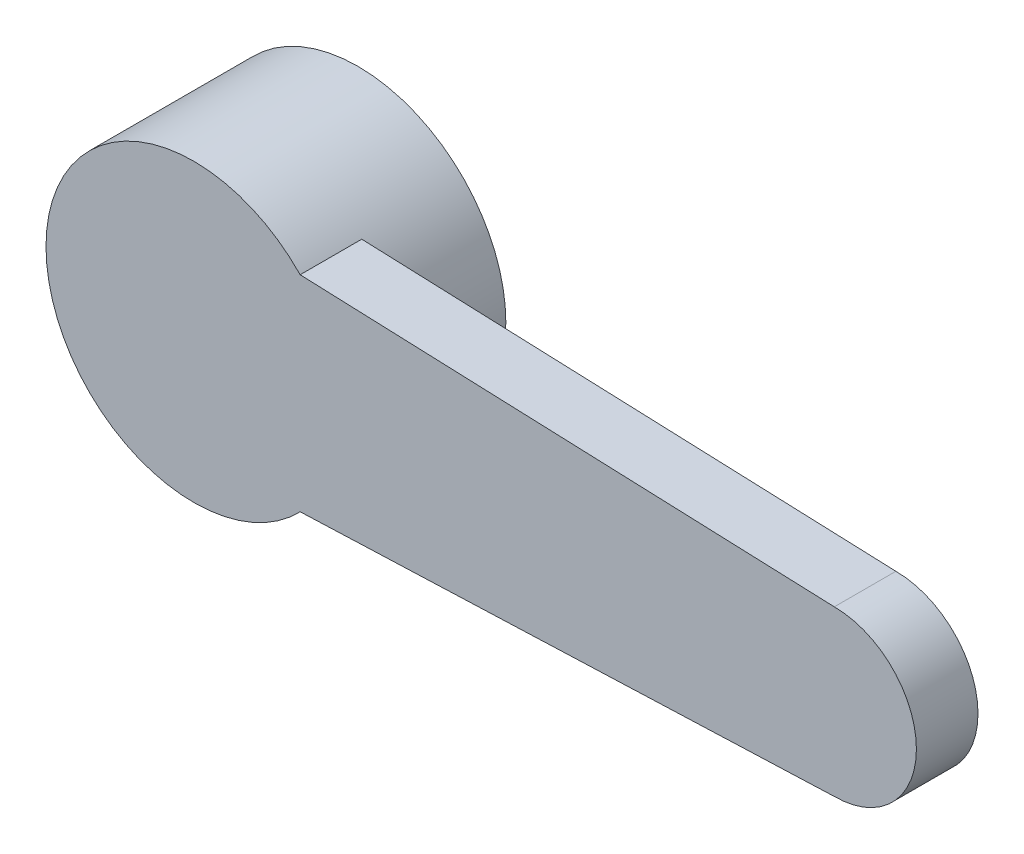
ISO-10303-21;
HEADER;
FILE_DESCRIPTION(('STEP AP214'),'2;1');
FILE_NAME('part.step','',(''),(''),'','','');
FILE_SCHEMA(('AUTOMOTIVE_DESIGN { 1 0 10303 214 1 1 1 1 }'));
ENDSEC;
DATA;
#1=APPLICATION_CONTEXT('core data for automotive mechanical design processes');
#2=APPLICATION_PROTOCOL_DEFINITION('international standard','automotive_design',2000,#1);
#3=PRODUCT_CONTEXT('',#1,'mechanical');
#4=PRODUCT('Part','Part','',(#3));
#5=PRODUCT_RELATED_PRODUCT_CATEGORY('part','',(#4));
#6=PRODUCT_DEFINITION_FORMATION('','',#4);
#7=PRODUCT_DEFINITION_CONTEXT('part definition',#1,'design');
#8=PRODUCT_DEFINITION('design','',#6,#7);
#9=PRODUCT_DEFINITION_SHAPE('','',#8);
#10=(LENGTH_UNIT() NAMED_UNIT(*) SI_UNIT(.MILLI.,.METRE.));
#11=(NAMED_UNIT(*) PLANE_ANGLE_UNIT() SI_UNIT($,.RADIAN.));
#12=(NAMED_UNIT(*) SI_UNIT($,.STERADIAN.) SOLID_ANGLE_UNIT());
#13=UNCERTAINTY_MEASURE_WITH_UNIT(LENGTH_MEASURE(1.E-05),#10,'distance_accuracy_value','');
#14=(GEOMETRIC_REPRESENTATION_CONTEXT(3) GLOBAL_UNCERTAINTY_ASSIGNED_CONTEXT((#13)) GLOBAL_UNIT_ASSIGNED_CONTEXT((#10,
#11,#12)) REPRESENTATION_CONTEXT('',''));
#15=CARTESIAN_POINT('',(0.,0.,0.));
#16=DIRECTION('',(0.,0.,1.));
#17=DIRECTION('',(1.,0.,0.));
#18=AXIS2_PLACEMENT_3D('',#15,#16,#17);
#19=CARTESIAN_POINT('',(0.,0.,4.));
#20=DIRECTION('',(0.,0.,-1.));
#21=DIRECTION('',(-1.,0.,0.));
#22=AXIS2_PLACEMENT_3D('',#19,#20,#21);
#23=CYLINDRICAL_SURFACE('',#22,3.6);
#24=CARTESIAN_POINT('',(0.,0.,4.));
#25=DIRECTION('',(0.,0.,1.));
#26=DIRECTION('',(1.,0.,0.));
#27=AXIS2_PLACEMENT_3D('',#24,#25,#26);
#28=CIRCLE('',#27,3.6);
#29=CARTESIAN_POINT('',(2.59036676939773,2.5,4.));
#30=VERTEX_POINT('',#29);
#31=CARTESIAN_POINT('',(2.59036676939773,-2.5,4.));
#32=VERTEX_POINT('',#31);
#33=EDGE_CURVE('E47',#30,#32,#28,.T.);
#34=ORIENTED_EDGE('',*,*,#33,.F.);
#35=DIRECTION('',(0.,0.,1.));
#36=VECTOR('',#35,1.);
#37=CARTESIAN_POINT('',(2.59036676939773,2.5,2.5));
#38=LINE('',#37,#36);
#39=CARTESIAN_POINT('',(2.59036676939773,2.5,2.5));
#40=VERTEX_POINT('',#39);
#41=EDGE_CURVE('E113',#40,#30,#38,.T.);
#42=ORIENTED_EDGE('',*,*,#41,.F.);
#43=CARTESIAN_POINT('',(0.,0.,2.5));
#44=DIRECTION('',(0.,0.,-1.));
#45=DIRECTION('',(-1.,0.,0.));
#46=AXIS2_PLACEMENT_3D('',#43,#44,#45);
#47=CIRCLE('',#46,3.6);
#48=CARTESIAN_POINT('',(2.59036676939773,-2.5,2.5));
#49=VERTEX_POINT('',#48);
#50=EDGE_CURVE('E11',#40,#49,#47,.T.);
#51=ORIENTED_EDGE('',*,*,#50,.T.);
#52=DIRECTION('',(0.,0.,1.));
#53=VECTOR('',#52,1.);
#54=CARTESIAN_POINT('',(2.59036676939773,-2.5,2.5));
#55=LINE('',#54,#53);
#56=EDGE_CURVE('E85',#49,#32,#55,.T.);
#57=ORIENTED_EDGE('',*,*,#56,.T.);
#58=EDGE_LOOP('',(#34,#42,#51,#57));
#59=FACE_BOUND('',#58,.T.);
#60=CARTESIAN_POINT('',(0.,0.,0.));
#61=DIRECTION('',(0.,0.,1.));
#62=DIRECTION('',(1.,0.,0.));
#63=AXIS2_PLACEMENT_3D('',#60,#61,#62);
#64=CIRCLE('',#63,3.6);
#65=CARTESIAN_POINT('',(3.6,0.,0.));
#66=VERTEX_POINT('',#65);
#67=EDGE_CURVE('E116',#66,#66,#64,.T.);
#68=ORIENTED_EDGE('',*,*,#67,.T.);
#69=EDGE_LOOP('',(#68));
#70=FACE_BOUND('',#69,.T.);
#71=ADVANCED_FACE('F39',(#59,#70),#23,.T.);
#72=CARTESIAN_POINT('',(0.,0.,4.));
#73=DIRECTION('',(0.,0.,1.));
#74=DIRECTION('',(1.,0.,0.));
#75=AXIS2_PLACEMENT_3D('',#72,#73,#74);
#76=PLANE('',#75);
#77=ORIENTED_EDGE('',*,*,#33,.T.);
#78=DIRECTION('',(0.999262267170796,0.0384047055538915,0.));
#79=VECTOR('',#78,1.);
#80=CARTESIAN_POINT('',(2.59036676939773,-2.5,4.));
#81=LINE('',#80,#79);
#82=CARTESIAN_POINT('',(15.6,-2.,4.));
#83=VERTEX_POINT('',#82);
#84=EDGE_CURVE('E108',#32,#83,#81,.T.);
#85=ORIENTED_EDGE('',*,*,#84,.T.);
#86=CARTESIAN_POINT('',(15.6,0.,4.));
#87=DIRECTION('',(0.,0.,1.));
#88=DIRECTION('',(-1.,0.,0.));
#89=AXIS2_PLACEMENT_3D('',#86,#87,#88);
#90=CIRCLE('',#89,2.);
#91=CARTESIAN_POINT('',(15.6,2.,4.));
#92=VERTEX_POINT('',#91);
#93=EDGE_CURVE('E91',#83,#92,#90,.T.);
#94=ORIENTED_EDGE('',*,*,#93,.T.);
#95=DIRECTION('',(-0.999262267170796,0.0384047055538908,0.));
#96=VECTOR('',#95,1.);
#97=CARTESIAN_POINT('',(2.59036676939773,2.5,4.));
#98=LINE('',#97,#96);
#99=EDGE_CURVE('E54',#92,#30,#98,.T.);
#100=ORIENTED_EDGE('',*,*,#99,.T.);
#101=EDGE_LOOP('',(#77,#85,#94,#100));
#102=FACE_BOUND('',#101,.T.);
#103=ADVANCED_FACE('F130',(#102),#76,.T.);
#104=CARTESIAN_POINT('',(0.,0.,0.));
#105=DIRECTION('',(0.,0.,1.));
#106=DIRECTION('',(1.,0.,0.));
#107=AXIS2_PLACEMENT_3D('',#104,#105,#106);
#108=PLANE('',#107);
#109=ORIENTED_EDGE('',*,*,#67,.F.);
#110=EDGE_LOOP('',(#109));
#111=FACE_BOUND('',#110,.T.);
#112=ADVANCED_FACE('F127',(#111),#108,.F.);
#113=CARTESIAN_POINT('',(2.59036676939773,2.5,2.5));
#114=DIRECTION('',(0.0384047055538908,0.999262267170796,0.));
#115=DIRECTION('',(-0.999262267170796,0.0384047055538908,0.));
#116=AXIS2_PLACEMENT_3D('',#113,#114,#115);
#117=PLANE('',#116);
#118=ORIENTED_EDGE('',*,*,#99,.F.);
#119=DIRECTION('',(0.,0.,1.));
#120=VECTOR('',#119,1.);
#121=CARTESIAN_POINT('',(15.6,2.,2.5));
#122=LINE('',#121,#120);
#123=CARTESIAN_POINT('',(15.6,2.,2.5));
#124=VERTEX_POINT('',#123);
#125=EDGE_CURVE('E79',#124,#92,#122,.T.);
#126=ORIENTED_EDGE('',*,*,#125,.F.);
#127=DIRECTION('',(-0.999262267170796,0.0384047055538908,0.));
#128=VECTOR('',#127,1.);
#129=CARTESIAN_POINT('',(2.59036676939773,2.5,2.5));
#130=LINE('',#129,#128);
#131=EDGE_CURVE('E97',#124,#40,#130,.T.);
#132=ORIENTED_EDGE('',*,*,#131,.T.);
#133=ORIENTED_EDGE('',*,*,#41,.T.);
#134=EDGE_LOOP('',(#118,#126,#132,#133));
#135=FACE_BOUND('',#134,.T.);
#136=ADVANCED_FACE('F129',(#135),#117,.T.);
#137=CARTESIAN_POINT('',(15.6,0.,2.5));
#138=DIRECTION('',(0.,0.,1.));
#139=DIRECTION('',(1.,0.,0.));
#140=AXIS2_PLACEMENT_3D('',#137,#138,#139);
#141=CYLINDRICAL_SURFACE('',#140,2.);
#142=ORIENTED_EDGE('',*,*,#93,.F.);
#143=DIRECTION('',(0.,0.,1.));
#144=VECTOR('',#143,1.);
#145=CARTESIAN_POINT('',(15.6,-2.,2.5));
#146=LINE('',#145,#144);
#147=CARTESIAN_POINT('',(15.6,-2.,2.5));
#148=VERTEX_POINT('',#147);
#149=EDGE_CURVE('E87',#148,#83,#146,.T.);
#150=ORIENTED_EDGE('',*,*,#149,.F.);
#151=CARTESIAN_POINT('',(15.6,0.,2.5));
#152=DIRECTION('',(0.,0.,1.));
#153=DIRECTION('',(-1.,0.,0.));
#154=AXIS2_PLACEMENT_3D('',#151,#152,#153);
#155=CIRCLE('',#154,2.);
#156=EDGE_CURVE('E90',#148,#124,#155,.T.);
#157=ORIENTED_EDGE('',*,*,#156,.T.);
#158=ORIENTED_EDGE('',*,*,#125,.T.);
#159=EDGE_LOOP('',(#142,#150,#157,#158));
#160=FACE_BOUND('',#159,.T.);
#161=ADVANCED_FACE('F89',(#160),#141,.T.);
#162=CARTESIAN_POINT('',(2.59036676939773,-2.5,2.5));
#163=DIRECTION('',(0.0384047055538915,-0.999262267170796,0.));
#164=DIRECTION('',(0.999262267170796,0.0384047055538915,0.));
#165=AXIS2_PLACEMENT_3D('',#162,#163,#164);
#166=PLANE('',#165);
#167=ORIENTED_EDGE('',*,*,#84,.F.);
#168=ORIENTED_EDGE('',*,*,#56,.F.);
#169=DIRECTION('',(0.999262267170796,0.0384047055538915,0.));
#170=VECTOR('',#169,1.);
#171=CARTESIAN_POINT('',(2.59036676939773,-2.5,2.5));
#172=LINE('',#171,#170);
#173=EDGE_CURVE('E96',#49,#148,#172,.T.);
#174=ORIENTED_EDGE('',*,*,#173,.T.);
#175=ORIENTED_EDGE('',*,*,#149,.T.);
#176=EDGE_LOOP('',(#167,#168,#174,#175));
#177=FACE_BOUND('',#176,.T.);
#178=ADVANCED_FACE('F100',(#177),#166,.T.);
#179=CARTESIAN_POINT('',(15.6,0.,2.5));
#180=DIRECTION('',(0.,0.,-1.));
#181=DIRECTION('',(-1.,0.,0.));
#182=AXIS2_PLACEMENT_3D('',#179,#180,#181);
#183=PLANE('',#182);
#184=ORIENTED_EDGE('',*,*,#50,.F.);
#185=ORIENTED_EDGE('',*,*,#131,.F.);
#186=ORIENTED_EDGE('',*,*,#156,.F.);
#187=ORIENTED_EDGE('',*,*,#173,.F.);
#188=EDGE_LOOP('',(#184,#185,#186,#187));
#189=FACE_BOUND('',#188,.T.);
#190=ADVANCED_FACE('F95',(#189),#183,.T.);
#191=CLOSED_SHELL('',(#71,#103,#112,#136,#161,#178,#190));
#192=MANIFOLD_SOLID_BREP('B2',#191);
#193=ADVANCED_BREP_SHAPE_REPRESENTATION('',(#18,#192),#14);
#194=SHAPE_DEFINITION_REPRESENTATION(#9,#193);
ENDSEC;
END-ISO-10303-21;
